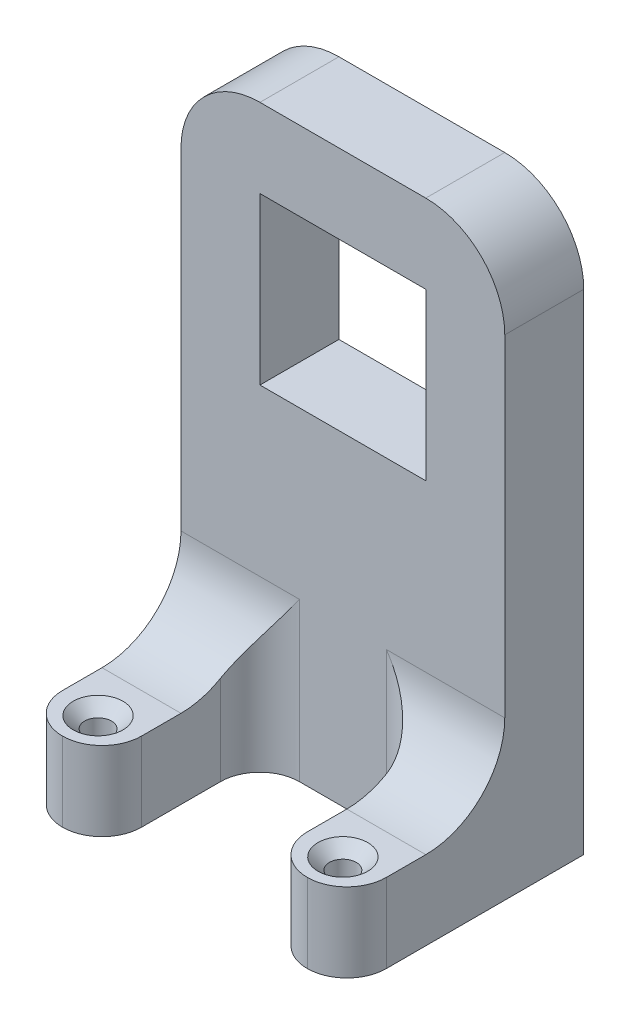
ISO-10303-21;
HEADER;
FILE_DESCRIPTION(('STEP AP214'),'2;1');
FILE_NAME('part.step','',(''),(''),'','','');
FILE_SCHEMA(('AUTOMOTIVE_DESIGN { 1 0 10303 214 1 1 1 1 }'));
ENDSEC;
DATA;
#1=APPLICATION_CONTEXT('core data for automotive mechanical design processes');
#2=APPLICATION_PROTOCOL_DEFINITION('international standard','automotive_design',2000,#1);
#3=PRODUCT_CONTEXT('',#1,'mechanical');
#4=PRODUCT('Part','Part','',(#3));
#5=PRODUCT_RELATED_PRODUCT_CATEGORY('part','',(#4));
#6=PRODUCT_DEFINITION_FORMATION('','',#4);
#7=PRODUCT_DEFINITION_CONTEXT('part definition',#1,'design');
#8=PRODUCT_DEFINITION('design','',#6,#7);
#9=PRODUCT_DEFINITION_SHAPE('','',#8);
#10=(LENGTH_UNIT() NAMED_UNIT(*) SI_UNIT(.MILLI.,.METRE.));
#11=(NAMED_UNIT(*) PLANE_ANGLE_UNIT() SI_UNIT($,.RADIAN.));
#12=(NAMED_UNIT(*) SI_UNIT($,.STERADIAN.) SOLID_ANGLE_UNIT());
#13=UNCERTAINTY_MEASURE_WITH_UNIT(LENGTH_MEASURE(1.E-05),#10,'distance_accuracy_value','');
#14=(GEOMETRIC_REPRESENTATION_CONTEXT(3) GLOBAL_UNCERTAINTY_ASSIGNED_CONTEXT((#13)) GLOBAL_UNIT_ASSIGNED_CONTEXT((#10,
#11,#12)) REPRESENTATION_CONTEXT('',''));
#15=CARTESIAN_POINT('',(0.,0.,0.));
#16=DIRECTION('',(0.,0.,1.));
#17=DIRECTION('',(1.,0.,0.));
#18=AXIS2_PLACEMENT_3D('',#15,#16,#17);
#19=CARTESIAN_POINT('',(0.,0.,10.));
#20=DIRECTION('',(0.,0.,1.));
#21=DIRECTION('',(1.,0.,0.));
#22=AXIS2_PLACEMENT_3D('',#19,#20,#21);
#23=PLANE('',#22);
#24=DIRECTION('',(1.,0.,0.));
#25=VECTOR('',#24,1.);
#26=CARTESIAN_POINT('',(10.,41.,10.));
#27=LINE('',#26,#25);
#28=CARTESIAN_POINT('',(10.,41.,10.));
#29=VERTEX_POINT('',#28);
#30=CARTESIAN_POINT('',(31.,41.,10.));
#31=VERTEX_POINT('',#30);
#32=EDGE_CURVE('E203',#29,#31,#27,.T.);
#33=ORIENTED_EDGE('',*,*,#32,.F.);
#34=DIRECTION('',(0.,-1.,0.));
#35=VECTOR('',#34,1.);
#36=CARTESIAN_POINT('',(10.,62.,10.));
#37=LINE('',#36,#35);
#38=CARTESIAN_POINT('',(10.,62.,10.));
#39=VERTEX_POINT('',#38);
#40=EDGE_CURVE('E192',#39,#29,#37,.T.);
#41=ORIENTED_EDGE('',*,*,#40,.F.);
#42=DIRECTION('',(-1.,0.,0.));
#43=VECTOR('',#42,1.);
#44=CARTESIAN_POINT('',(10.,62.,10.));
#45=LINE('',#44,#43);
#46=CARTESIAN_POINT('',(31.,62.,10.));
#47=VERTEX_POINT('',#46);
#48=EDGE_CURVE('E222',#47,#39,#45,.T.);
#49=ORIENTED_EDGE('',*,*,#48,.F.);
#50=DIRECTION('',(0.,1.,0.));
#51=VECTOR('',#50,1.);
#52=CARTESIAN_POINT('',(31.,62.,10.));
#53=LINE('',#52,#51);
#54=EDGE_CURVE('E218',#31,#47,#53,.T.);
#55=ORIENTED_EDGE('',*,*,#54,.F.);
#56=EDGE_LOOP('',(#33,#41,#49,#55));
#57=FACE_BOUND('',#56,.T.);
#58=DIRECTION('',(0.,-1.,0.));
#59=VECTOR('',#58,1.);
#60=CARTESIAN_POINT('',(26.,0.,10.));
#61=LINE('',#60,#59);
#62=CARTESIAN_POINT('',(26.,0.,10.));
#63=VERTEX_POINT('',#62);
#64=CARTESIAN_POINT('',(26.,20.,10.));
#65=VERTEX_POINT('',#64);
#66=EDGE_CURVE('E317',#63,#65,#61,.F.);
#67=ORIENTED_EDGE('',*,*,#66,.T.);
#68=DIRECTION('',(-1.,0.,0.));
#69=VECTOR('',#68,1.);
#70=CARTESIAN_POINT('',(0.,20.,10.));
#71=LINE('',#70,#69);
#72=CARTESIAN_POINT('',(41.,20.,10.));
#73=VERTEX_POINT('',#72);
#74=EDGE_CURVE('E382',#65,#73,#71,.F.);
#75=ORIENTED_EDGE('',*,*,#74,.T.);
#76=DIRECTION('',(0.,1.,0.));
#77=VECTOR('',#76,1.);
#78=CARTESIAN_POINT('',(41.,0.,10.));
#79=LINE('',#78,#77);
#80=CARTESIAN_POINT('',(41.,62.,10.));
#81=VERTEX_POINT('',#80);
#82=EDGE_CURVE('E257',#73,#81,#79,.T.);
#83=ORIENTED_EDGE('',*,*,#82,.T.);
#84=CARTESIAN_POINT('',(31.,62.,10.));
#85=DIRECTION('',(0.,0.,1.));
#86=DIRECTION('',(1.,0.,0.));
#87=AXIS2_PLACEMENT_3D('',#84,#85,#86);
#88=CIRCLE('',#87,10.);
#89=CARTESIAN_POINT('',(31.,72.,10.));
#90=VERTEX_POINT('',#89);
#91=EDGE_CURVE('E301',#81,#90,#88,.T.);
#92=ORIENTED_EDGE('',*,*,#91,.T.);
#93=DIRECTION('',(-1.,0.,0.));
#94=VECTOR('',#93,1.);
#95=CARTESIAN_POINT('',(41.,72.,10.));
#96=LINE('',#95,#94);
#97=CARTESIAN_POINT('',(10.,72.,10.));
#98=VERTEX_POINT('',#97);
#99=EDGE_CURVE('E260',#90,#98,#96,.T.);
#100=ORIENTED_EDGE('',*,*,#99,.T.);
#101=CARTESIAN_POINT('',(10.,62.,10.));
#102=DIRECTION('',(0.,0.,1.));
#103=DIRECTION('',(1.,0.,0.));
#104=AXIS2_PLACEMENT_3D('',#101,#102,#103);
#105=CIRCLE('',#104,10.);
#106=CARTESIAN_POINT('',(0.,62.,10.));
#107=VERTEX_POINT('',#106);
#108=EDGE_CURVE('E304',#98,#107,#105,.T.);
#109=ORIENTED_EDGE('',*,*,#108,.T.);
#110=DIRECTION('',(0.,-1.,0.));
#111=VECTOR('',#110,1.);
#112=CARTESIAN_POINT('',(0.,72.,10.));
#113=LINE('',#112,#111);
#114=CARTESIAN_POINT('',(0.,20.,10.));
#115=VERTEX_POINT('',#114);
#116=EDGE_CURVE('E248',#107,#115,#113,.T.);
#117=ORIENTED_EDGE('',*,*,#116,.T.);
#118=DIRECTION('',(-1.,0.,0.));
#119=VECTOR('',#118,1.);
#120=CARTESIAN_POINT('',(0.,20.,10.));
#121=LINE('',#120,#119);
#122=CARTESIAN_POINT('',(15.,20.,10.));
#123=VERTEX_POINT('',#122);
#124=EDGE_CURVE('E378',#115,#123,#121,.F.);
#125=ORIENTED_EDGE('',*,*,#124,.T.);
#126=DIRECTION('',(0.,1.,0.));
#127=VECTOR('',#126,1.);
#128=CARTESIAN_POINT('',(15.,0.,10.));
#129=LINE('',#128,#127);
#130=CARTESIAN_POINT('',(15.,0.,10.));
#131=VERTEX_POINT('',#130);
#132=EDGE_CURVE('E320',#123,#131,#129,.F.);
#133=ORIENTED_EDGE('',*,*,#132,.T.);
#134=DIRECTION('',(1.,0.,0.));
#135=VECTOR('',#134,1.);
#136=CARTESIAN_POINT('',(0.,0.,10.));
#137=LINE('',#136,#135);
#138=EDGE_CURVE('E252',#131,#63,#137,.T.);
#139=ORIENTED_EDGE('',*,*,#138,.T.);
#140=EDGE_LOOP('',(#67,#75,#83,#92,#100,#109,#117,#125,#133,#139));
#141=FACE_BOUND('',#140,.T.);
#142=ADVANCED_FACE('F39',(#57,#141),#23,.T.);
#143=CARTESIAN_POINT('',(0.,0.,0.));
#144=DIRECTION('',(0.,0.,1.));
#145=DIRECTION('',(1.,0.,0.));
#146=AXIS2_PLACEMENT_3D('',#143,#144,#145);
#147=PLANE('',#146);
#148=DIRECTION('',(0.,-1.,0.));
#149=VECTOR('',#148,1.);
#150=CARTESIAN_POINT('',(0.,72.,0.));
#151=LINE('',#150,#149);
#152=CARTESIAN_POINT('',(0.,62.,0.));
#153=VERTEX_POINT('',#152);
#154=CARTESIAN_POINT('',(0.,0.,0.));
#155=VERTEX_POINT('',#154);
#156=EDGE_CURVE('E212',#153,#155,#151,.T.);
#157=ORIENTED_EDGE('',*,*,#156,.F.);
#158=CARTESIAN_POINT('',(10.,62.,0.));
#159=DIRECTION('',(0.,0.,1.));
#160=DIRECTION('',(1.,0.,0.));
#161=AXIS2_PLACEMENT_3D('',#158,#159,#160);
#162=CIRCLE('',#161,10.);
#163=CARTESIAN_POINT('',(10.,72.,0.));
#164=VERTEX_POINT('',#163);
#165=EDGE_CURVE('E291',#153,#164,#162,.F.);
#166=ORIENTED_EDGE('',*,*,#165,.T.);
#167=DIRECTION('',(-1.,0.,0.));
#168=VECTOR('',#167,1.);
#169=CARTESIAN_POINT('',(41.,72.,0.));
#170=LINE('',#169,#168);
#171=CARTESIAN_POINT('',(31.,72.,0.));
#172=VERTEX_POINT('',#171);
#173=EDGE_CURVE('E253',#172,#164,#170,.T.);
#174=ORIENTED_EDGE('',*,*,#173,.F.);
#175=CARTESIAN_POINT('',(31.,62.,0.));
#176=DIRECTION('',(0.,0.,1.));
#177=DIRECTION('',(1.,0.,0.));
#178=AXIS2_PLACEMENT_3D('',#175,#176,#177);
#179=CIRCLE('',#178,10.);
#180=CARTESIAN_POINT('',(41.,62.,0.));
#181=VERTEX_POINT('',#180);
#182=EDGE_CURVE('E288',#172,#181,#179,.F.);
#183=ORIENTED_EDGE('',*,*,#182,.T.);
#184=DIRECTION('',(0.,1.,0.));
#185=VECTOR('',#184,1.);
#186=CARTESIAN_POINT('',(41.,0.,0.));
#187=LINE('',#186,#185);
#188=CARTESIAN_POINT('',(41.,0.,0.));
#189=VERTEX_POINT('',#188);
#190=EDGE_CURVE('E272',#189,#181,#187,.T.);
#191=ORIENTED_EDGE('',*,*,#190,.F.);
#192=DIRECTION('',(1.,0.,0.));
#193=VECTOR('',#192,1.);
#194=CARTESIAN_POINT('',(0.,0.,0.));
#195=LINE('',#194,#193);
#196=EDGE_CURVE('E268',#155,#189,#195,.T.);
#197=ORIENTED_EDGE('',*,*,#196,.F.);
#198=EDGE_LOOP('',(#157,#166,#174,#183,#191,#197));
#199=FACE_BOUND('',#198,.T.);
#200=DIRECTION('',(0.,-1.,0.));
#201=VECTOR('',#200,1.);
#202=CARTESIAN_POINT('',(10.,62.,0.));
#203=LINE('',#202,#201);
#204=CARTESIAN_POINT('',(10.,62.,0.));
#205=VERTEX_POINT('',#204);
#206=CARTESIAN_POINT('',(10.,41.,0.));
#207=VERTEX_POINT('',#206);
#208=EDGE_CURVE('E228',#205,#207,#203,.T.);
#209=ORIENTED_EDGE('',*,*,#208,.T.);
#210=DIRECTION('',(1.,0.,0.));
#211=VECTOR('',#210,1.);
#212=CARTESIAN_POINT('',(10.,41.,0.));
#213=LINE('',#212,#211);
#214=CARTESIAN_POINT('',(31.,41.,0.));
#215=VERTEX_POINT('',#214);
#216=EDGE_CURVE('E210',#207,#215,#213,.T.);
#217=ORIENTED_EDGE('',*,*,#216,.T.);
#218=DIRECTION('',(0.,1.,0.));
#219=VECTOR('',#218,1.);
#220=CARTESIAN_POINT('',(31.,62.,0.));
#221=LINE('',#220,#219);
#222=CARTESIAN_POINT('',(31.,62.,0.));
#223=VERTEX_POINT('',#222);
#224=EDGE_CURVE('E234',#215,#223,#221,.T.);
#225=ORIENTED_EDGE('',*,*,#224,.T.);
#226=DIRECTION('',(-1.,0.,0.));
#227=VECTOR('',#226,1.);
#228=CARTESIAN_POINT('',(10.,62.,0.));
#229=LINE('',#228,#227);
#230=EDGE_CURVE('E204',#223,#205,#229,.T.);
#231=ORIENTED_EDGE('',*,*,#230,.T.);
#232=EDGE_LOOP('',(#209,#217,#225,#231));
#233=FACE_BOUND('',#232,.T.);
#234=ADVANCED_FACE('F428',(#199,#233),#147,.F.);
#235=CARTESIAN_POINT('',(0.,72.,10.));
#236=DIRECTION('',(1.,0.,0.));
#237=DIRECTION('',(0.,1.,0.));
#238=AXIS2_PLACEMENT_3D('',#235,#236,#237);
#239=PLANE('',#238);
#240=DIRECTION('',(0.,0.,-1.));
#241=VECTOR('',#240,1.);
#242=CARTESIAN_POINT('',(0.,0.,10.));
#243=LINE('',#242,#241);
#244=CARTESIAN_POINT('',(0.,0.,25.));
#245=VERTEX_POINT('',#244);
#246=EDGE_CURVE('E281',#245,#155,#243,.T.);
#247=ORIENTED_EDGE('',*,*,#246,.F.);
#248=DIRECTION('',(0.,-1.,0.));
#249=VECTOR('',#248,1.);
#250=CARTESIAN_POINT('',(0.,10.,25.));
#251=LINE('',#250,#249);
#252=CARTESIAN_POINT('',(0.,10.,25.));
#253=VERTEX_POINT('',#252);
#254=EDGE_CURVE('E356',#245,#253,#251,.F.);
#255=ORIENTED_EDGE('',*,*,#254,.T.);
#256=DIRECTION('',(0.,0.,-1.));
#257=VECTOR('',#256,1.);
#258=CARTESIAN_POINT('',(0.,10.,30.));
#259=LINE('',#258,#257);
#260=CARTESIAN_POINT('',(0.,10.,20.));
#261=VERTEX_POINT('',#260);
#262=EDGE_CURVE('E490',#253,#261,#259,.T.);
#263=ORIENTED_EDGE('',*,*,#262,.T.);
#264=CARTESIAN_POINT('',(0.,20.,20.));
#265=DIRECTION('',(1.,0.,0.));
#266=DIRECTION('',(0.,1.,0.));
#267=AXIS2_PLACEMENT_3D('',#264,#265,#266);
#268=CIRCLE('',#267,10.);
#269=EDGE_CURVE('E471',#261,#115,#268,.T.);
#270=ORIENTED_EDGE('',*,*,#269,.T.);
#271=ORIENTED_EDGE('',*,*,#116,.F.);
#272=DIRECTION('',(0.,0.,-1.));
#273=VECTOR('',#272,1.);
#274=CARTESIAN_POINT('',(0.,62.,10.));
#275=LINE('',#274,#273);
#276=EDGE_CURVE('E284',#107,#153,#275,.T.);
#277=ORIENTED_EDGE('',*,*,#276,.T.);
#278=ORIENTED_EDGE('',*,*,#156,.T.);
#279=EDGE_LOOP('',(#247,#255,#263,#270,#271,#277,#278));
#280=FACE_BOUND('',#279,.T.);
#281=ADVANCED_FACE('F433',(#280),#239,.F.);
#282=CARTESIAN_POINT('',(0.,0.,10.));
#283=DIRECTION('',(0.,1.,0.));
#284=DIRECTION('',(0.,0.,1.));
#285=AXIS2_PLACEMENT_3D('',#282,#283,#284);
#286=PLANE('',#285);
#287=CARTESIAN_POINT('',(5.,0.,25.5));
#288=DIRECTION('',(0.,1.,0.));
#289=DIRECTION('',(0.,0.,1.));
#290=AXIS2_PLACEMENT_3D('',#287,#288,#289);
#291=CIRCLE('',#290,1.69999999999999);
#292=CARTESIAN_POINT('',(5.,0.,27.2));
#293=VERTEX_POINT('',#292);
#294=EDGE_CURVE('E764',#293,#293,#291,.T.);
#295=ORIENTED_EDGE('',*,*,#294,.T.);
#296=EDGE_LOOP('',(#295));
#297=FACE_BOUND('',#296,.T.);
#298=CARTESIAN_POINT('',(36.,0.,25.5));
#299=DIRECTION('',(0.,1.,0.));
#300=DIRECTION('',(0.,0.,1.));
#301=AXIS2_PLACEMENT_3D('',#298,#299,#300);
#302=CIRCLE('',#301,1.69999999999999);
#303=CARTESIAN_POINT('',(36.,0.,27.2));
#304=VERTEX_POINT('',#303);
#305=EDGE_CURVE('E504',#304,#304,#302,.T.);
#306=ORIENTED_EDGE('',*,*,#305,.T.);
#307=EDGE_LOOP('',(#306));
#308=FACE_BOUND('',#307,.T.);
#309=DIRECTION('',(0.,0.,-1.));
#310=VECTOR('',#309,1.);
#311=CARTESIAN_POINT('',(41.,0.,10.));
#312=LINE('',#311,#310);
#313=CARTESIAN_POINT('',(41.,0.,25.));
#314=VERTEX_POINT('',#313);
#315=EDGE_CURVE('E264',#314,#189,#312,.T.);
#316=ORIENTED_EDGE('',*,*,#315,.F.);
#317=CARTESIAN_POINT('',(36.,0.,25.));
#318=DIRECTION('',(0.,1.,0.));
#319=DIRECTION('',(0.,0.,1.));
#320=AXIS2_PLACEMENT_3D('',#317,#318,#319);
#321=CIRCLE('',#320,5.);
#322=CARTESIAN_POINT('',(36.,0.,30.));
#323=VERTEX_POINT('',#322);
#324=EDGE_CURVE('E347',#314,#323,#321,.F.);
#325=ORIENTED_EDGE('',*,*,#324,.T.);
#326=CARTESIAN_POINT('',(36.,0.,25.));
#327=DIRECTION('',(0.,1.,0.));
#328=DIRECTION('',(0.,0.,1.));
#329=AXIS2_PLACEMENT_3D('',#326,#327,#328);
#330=CIRCLE('',#329,5.);
#331=CARTESIAN_POINT('',(31.,0.,25.));
#332=VERTEX_POINT('',#331);
#333=EDGE_CURVE('E344',#323,#332,#330,.F.);
#334=ORIENTED_EDGE('',*,*,#333,.T.);
#335=DIRECTION('',(0.,0.,-1.));
#336=VECTOR('',#335,1.);
#337=CARTESIAN_POINT('',(31.,0.,30.));
#338=LINE('',#337,#336);
#339=CARTESIAN_POINT('',(31.,0.,15.));
#340=VERTEX_POINT('',#339);
#341=EDGE_CURVE('E501',#332,#340,#338,.T.);
#342=ORIENTED_EDGE('',*,*,#341,.T.);
#343=CARTESIAN_POINT('',(26.,0.,15.));
#344=DIRECTION('',(0.,1.,0.));
#345=DIRECTION('',(0.,0.,1.));
#346=AXIS2_PLACEMENT_3D('',#343,#344,#345);
#347=CIRCLE('',#346,5.);
#348=EDGE_CURVE('E362',#340,#63,#347,.T.);
#349=ORIENTED_EDGE('',*,*,#348,.T.);
#350=ORIENTED_EDGE('',*,*,#138,.F.);
#351=CARTESIAN_POINT('',(15.,0.,15.));
#352=DIRECTION('',(0.,1.,0.));
#353=DIRECTION('',(0.,0.,1.));
#354=AXIS2_PLACEMENT_3D('',#351,#352,#353);
#355=CIRCLE('',#354,5.);
#356=CARTESIAN_POINT('',(10.,0.,15.));
#357=VERTEX_POINT('',#356);
#358=EDGE_CURVE('E359',#131,#357,#355,.T.);
#359=ORIENTED_EDGE('',*,*,#358,.T.);
#360=DIRECTION('',(0.,0.,-1.));
#361=VECTOR('',#360,1.);
#362=CARTESIAN_POINT('',(10.,0.,30.));
#363=LINE('',#362,#361);
#364=CARTESIAN_POINT('',(10.,0.,25.));
#365=VERTEX_POINT('',#364);
#366=EDGE_CURVE('E231',#365,#357,#363,.T.);
#367=ORIENTED_EDGE('',*,*,#366,.F.);
#368=CARTESIAN_POINT('',(5.,0.,25.));
#369=DIRECTION('',(0.,1.,0.));
#370=DIRECTION('',(0.,0.,1.));
#371=AXIS2_PLACEMENT_3D('',#368,#369,#370);
#372=CIRCLE('',#371,5.);
#373=CARTESIAN_POINT('',(5.,0.,30.));
#374=VERTEX_POINT('',#373);
#375=EDGE_CURVE('E341',#365,#374,#372,.F.);
#376=ORIENTED_EDGE('',*,*,#375,.T.);
#377=CARTESIAN_POINT('',(5.,0.,25.));
#378=DIRECTION('',(0.,1.,0.));
#379=DIRECTION('',(0.,0.,1.));
#380=AXIS2_PLACEMENT_3D('',#377,#378,#379);
#381=CIRCLE('',#380,5.);
#382=EDGE_CURVE('E338',#374,#245,#381,.F.);
#383=ORIENTED_EDGE('',*,*,#382,.T.);
#384=ORIENTED_EDGE('',*,*,#246,.T.);
#385=ORIENTED_EDGE('',*,*,#196,.T.);
#386=EDGE_LOOP('',(#316,#325,#334,#342,#349,#350,#359,#367,#376,#383,#384,#385));
#387=FACE_BOUND('',#386,.T.);
#388=ADVANCED_FACE('F446',(#297,#308,#387),#286,.F.);
#389=CARTESIAN_POINT('',(41.,0.,10.));
#390=DIRECTION('',(-1.,0.,0.));
#391=DIRECTION('',(0.,0.,1.));
#392=AXIS2_PLACEMENT_3D('',#389,#390,#391);
#393=PLANE('',#392);
#394=DIRECTION('',(0.,0.,-1.));
#395=VECTOR('',#394,1.);
#396=CARTESIAN_POINT('',(41.,10.,30.));
#397=LINE('',#396,#395);
#398=CARTESIAN_POINT('',(41.,10.,25.));
#399=VERTEX_POINT('',#398);
#400=CARTESIAN_POINT('',(41.,10.,20.));
#401=VERTEX_POINT('',#400);
#402=EDGE_CURVE('E480',#399,#401,#397,.T.);
#403=ORIENTED_EDGE('',*,*,#402,.F.);
#404=DIRECTION('',(0.,1.,0.));
#405=VECTOR('',#404,1.);
#406=CARTESIAN_POINT('',(41.,0.,25.));
#407=LINE('',#406,#405);
#408=EDGE_CURVE('E334',#399,#314,#407,.F.);
#409=ORIENTED_EDGE('',*,*,#408,.T.);
#410=ORIENTED_EDGE('',*,*,#315,.T.);
#411=ORIENTED_EDGE('',*,*,#190,.T.);
#412=DIRECTION('',(0.,0.,-1.));
#413=VECTOR('',#412,1.);
#414=CARTESIAN_POINT('',(41.,62.,10.));
#415=LINE('',#414,#413);
#416=EDGE_CURVE('E307',#181,#81,#415,.F.);
#417=ORIENTED_EDGE('',*,*,#416,.T.);
#418=ORIENTED_EDGE('',*,*,#82,.F.);
#419=CARTESIAN_POINT('',(41.,20.,20.));
#420=DIRECTION('',(-1.,0.,0.));
#421=DIRECTION('',(0.,0.,1.));
#422=AXIS2_PLACEMENT_3D('',#419,#420,#421);
#423=CIRCLE('',#422,10.);
#424=EDGE_CURVE('E400',#73,#401,#423,.T.);
#425=ORIENTED_EDGE('',*,*,#424,.T.);
#426=EDGE_LOOP('',(#403,#409,#410,#411,#417,#418,#425));
#427=FACE_BOUND('',#426,.T.);
#428=ADVANCED_FACE('F442',(#427),#393,.F.);
#429=CARTESIAN_POINT('',(41.,72.,10.));
#430=DIRECTION('',(0.,-1.,0.));
#431=DIRECTION('',(0.,0.,-1.));
#432=AXIS2_PLACEMENT_3D('',#429,#430,#431);
#433=PLANE('',#432);
#434=ORIENTED_EDGE('',*,*,#173,.T.);
#435=DIRECTION('',(0.,0.,-1.));
#436=VECTOR('',#435,1.);
#437=CARTESIAN_POINT('',(10.,72.,10.));
#438=LINE('',#437,#436);
#439=EDGE_CURVE('E298',#164,#98,#438,.F.);
#440=ORIENTED_EDGE('',*,*,#439,.T.);
#441=ORIENTED_EDGE('',*,*,#99,.F.);
#442=DIRECTION('',(0.,0.,-1.));
#443=VECTOR('',#442,1.);
#444=CARTESIAN_POINT('',(31.,72.,10.));
#445=LINE('',#444,#443);
#446=EDGE_CURVE('E294',#90,#172,#445,.T.);
#447=ORIENTED_EDGE('',*,*,#446,.T.);
#448=EDGE_LOOP('',(#434,#440,#441,#447));
#449=FACE_BOUND('',#448,.T.);
#450=ADVANCED_FACE('F439',(#449),#433,.F.);
#451=CARTESIAN_POINT('',(10.,62.,10.));
#452=DIRECTION('',(1.,0.,0.));
#453=DIRECTION('',(0.,1.,0.));
#454=AXIS2_PLACEMENT_3D('',#451,#452,#453);
#455=PLANE('',#454);
#456=ORIENTED_EDGE('',*,*,#208,.F.);
#457=DIRECTION('',(0.,0.,-1.));
#458=VECTOR('',#457,1.);
#459=CARTESIAN_POINT('',(10.,62.,10.));
#460=LINE('',#459,#458);
#461=EDGE_CURVE('E198',#39,#205,#460,.T.);
#462=ORIENTED_EDGE('',*,*,#461,.F.);
#463=ORIENTED_EDGE('',*,*,#40,.T.);
#464=DIRECTION('',(0.,0.,-1.));
#465=VECTOR('',#464,1.);
#466=CARTESIAN_POINT('',(10.,41.,10.));
#467=LINE('',#466,#465);
#468=EDGE_CURVE('E195',#29,#207,#467,.T.);
#469=ORIENTED_EDGE('',*,*,#468,.T.);
#470=EDGE_LOOP('',(#456,#462,#463,#469));
#471=FACE_BOUND('',#470,.T.);
#472=ADVANCED_FACE('F194',(#471),#455,.T.);
#473=CARTESIAN_POINT('',(10.,41.,10.));
#474=DIRECTION('',(0.,1.,0.));
#475=DIRECTION('',(0.,0.,1.));
#476=AXIS2_PLACEMENT_3D('',#473,#474,#475);
#477=PLANE('',#476);
#478=ORIENTED_EDGE('',*,*,#216,.F.);
#479=ORIENTED_EDGE('',*,*,#468,.F.);
#480=ORIENTED_EDGE('',*,*,#32,.T.);
#481=DIRECTION('',(0.,0.,-1.));
#482=VECTOR('',#481,1.);
#483=CARTESIAN_POINT('',(31.,41.,10.));
#484=LINE('',#483,#482);
#485=EDGE_CURVE('E213',#31,#215,#484,.T.);
#486=ORIENTED_EDGE('',*,*,#485,.T.);
#487=EDGE_LOOP('',(#478,#479,#480,#486));
#488=FACE_BOUND('',#487,.T.);
#489=ADVANCED_FACE('F207',(#488),#477,.T.);
#490=CARTESIAN_POINT('',(31.,62.,10.));
#491=DIRECTION('',(-1.,0.,0.));
#492=DIRECTION('',(0.,-1.,0.));
#493=AXIS2_PLACEMENT_3D('',#490,#491,#492);
#494=PLANE('',#493);
#495=ORIENTED_EDGE('',*,*,#224,.F.);
#496=ORIENTED_EDGE('',*,*,#485,.F.);
#497=ORIENTED_EDGE('',*,*,#54,.T.);
#498=DIRECTION('',(0.,0.,-1.));
#499=VECTOR('',#498,1.);
#500=CARTESIAN_POINT('',(31.,62.,10.));
#501=LINE('',#500,#499);
#502=EDGE_CURVE('E243',#47,#223,#501,.T.);
#503=ORIENTED_EDGE('',*,*,#502,.T.);
#504=EDGE_LOOP('',(#495,#496,#497,#503));
#505=FACE_BOUND('',#504,.T.);
#506=ADVANCED_FACE('F696',(#505),#494,.T.);
#507=CARTESIAN_POINT('',(10.,62.,10.));
#508=DIRECTION('',(0.,-1.,0.));
#509=DIRECTION('',(0.,0.,-1.));
#510=AXIS2_PLACEMENT_3D('',#507,#508,#509);
#511=PLANE('',#510);
#512=ORIENTED_EDGE('',*,*,#230,.F.);
#513=ORIENTED_EDGE('',*,*,#502,.F.);
#514=ORIENTED_EDGE('',*,*,#48,.T.);
#515=ORIENTED_EDGE('',*,*,#461,.T.);
#516=EDGE_LOOP('',(#512,#513,#514,#515));
#517=FACE_BOUND('',#516,.T.);
#518=ADVANCED_FACE('F609',(#517),#511,.T.);
#519=CARTESIAN_POINT('',(10.,0.,30.));
#520=DIRECTION('',(-1.,0.,0.));
#521=DIRECTION('',(0.,0.,1.));
#522=AXIS2_PLACEMENT_3D('',#519,#520,#521);
#523=PLANE('',#522);
#524=ORIENTED_EDGE('',*,*,#366,.T.);
#525=DIRECTION('',(0.,1.,0.));
#526=VECTOR('',#525,1.);
#527=CARTESIAN_POINT('',(10.,0.,15.));
#528=LINE('',#527,#526);
#529=CARTESIAN_POINT('',(10.,11.3397459621556,15.));
#530=VERTEX_POINT('',#529);
#531=EDGE_CURVE('E55',#357,#530,#528,.T.);
#532=ORIENTED_EDGE('',*,*,#531,.T.);
#533=CARTESIAN_POINT('',(10.,20.,20.));
#534=DIRECTION('',(-1.,0.,0.));
#535=DIRECTION('',(0.,0.,1.));
#536=AXIS2_PLACEMENT_3D('',#533,#534,#535);
#537=CIRCLE('',#536,10.);
#538=CARTESIAN_POINT('',(10.,10.,20.));
#539=VERTEX_POINT('',#538);
#540=EDGE_CURVE('E11',#530,#539,#537,.T.);
#541=ORIENTED_EDGE('',*,*,#540,.T.);
#542=DIRECTION('',(0.,0.,-1.));
#543=VECTOR('',#542,1.);
#544=CARTESIAN_POINT('',(10.,10.,30.));
#545=LINE('',#544,#543);
#546=CARTESIAN_POINT('',(10.,10.,25.));
#547=VERTEX_POINT('',#546);
#548=EDGE_CURVE('E510',#547,#539,#545,.T.);
#549=ORIENTED_EDGE('',*,*,#548,.F.);
#550=DIRECTION('',(0.,1.,0.));
#551=VECTOR('',#550,1.);
#552=CARTESIAN_POINT('',(10.,0.,25.));
#553=LINE('',#552,#551);
#554=EDGE_CURVE('E311',#547,#365,#553,.F.);
#555=ORIENTED_EDGE('',*,*,#554,.T.);
#556=EDGE_LOOP('',(#524,#532,#541,#549,#555));
#557=FACE_BOUND('',#556,.T.);
#558=ADVANCED_FACE('F515',(#557),#523,.F.);
#559=CARTESIAN_POINT('',(0.,10.,30.));
#560=DIRECTION('',(0.,-1.,0.));
#561=DIRECTION('',(1.,0.,0.));
#562=AXIS2_PLACEMENT_3D('',#559,#560,#561);
#563=PLANE('',#562);
#564=CARTESIAN_POINT('',(5.,10.,25.5));
#565=DIRECTION('',(0.,1.,0.));
#566=DIRECTION('',(0.,0.,1.));
#567=AXIS2_PLACEMENT_3D('',#564,#565,#566);
#568=CIRCLE('',#567,3.15);
#569=CARTESIAN_POINT('',(5.,10.,28.65));
#570=VERTEX_POINT('',#569);
#571=EDGE_CURVE('E370',#570,#570,#568,.T.);
#572=ORIENTED_EDGE('',*,*,#571,.F.);
#573=EDGE_LOOP('',(#572));
#574=FACE_BOUND('',#573,.T.);
#575=ORIENTED_EDGE('',*,*,#548,.T.);
#576=DIRECTION('',(-1.,0.,0.));
#577=VECTOR('',#576,1.);
#578=CARTESIAN_POINT('',(0.,10.,20.));
#579=LINE('',#578,#577);
#580=EDGE_CURVE('E385',#539,#261,#579,.T.);
#581=ORIENTED_EDGE('',*,*,#580,.T.);
#582=ORIENTED_EDGE('',*,*,#262,.F.);
#583=CARTESIAN_POINT('',(5.,10.,25.));
#584=DIRECTION('',(0.,-1.,0.));
#585=DIRECTION('',(1.,0.,0.));
#586=AXIS2_PLACEMENT_3D('',#583,#584,#585);
#587=CIRCLE('',#586,5.);
#588=CARTESIAN_POINT('',(5.,10.,30.));
#589=VERTEX_POINT('',#588);
#590=EDGE_CURVE('E350',#253,#589,#587,.F.);
#591=ORIENTED_EDGE('',*,*,#590,.T.);
#592=CARTESIAN_POINT('',(5.,10.,25.));
#593=DIRECTION('',(0.,-1.,0.));
#594=DIRECTION('',(1.,0.,0.));
#595=AXIS2_PLACEMENT_3D('',#592,#593,#594);
#596=CIRCLE('',#595,5.);
#597=EDGE_CURVE('E353',#589,#547,#596,.F.);
#598=ORIENTED_EDGE('',*,*,#597,.T.);
#599=EDGE_LOOP('',(#575,#581,#582,#591,#598));
#600=FACE_BOUND('',#599,.T.);
#601=ADVANCED_FACE('F526',(#574,#600),#563,.F.);
#602=CARTESIAN_POINT('',(41.,10.,30.));
#603=DIRECTION('',(0.,-1.,0.));
#604=DIRECTION('',(1.,0.,0.));
#605=AXIS2_PLACEMENT_3D('',#602,#603,#604);
#606=PLANE('',#605);
#607=CARTESIAN_POINT('',(36.,10.,25.5));
#608=DIRECTION('',(0.,1.,0.));
#609=DIRECTION('',(0.,0.,1.));
#610=AXIS2_PLACEMENT_3D('',#607,#608,#609);
#611=CIRCLE('',#610,3.15);
#612=CARTESIAN_POINT('',(36.,10.,28.65));
#613=VERTEX_POINT('',#612);
#614=EDGE_CURVE('E759',#613,#613,#611,.T.);
#615=ORIENTED_EDGE('',*,*,#614,.F.);
#616=EDGE_LOOP('',(#615));
#617=FACE_BOUND('',#616,.T.);
#618=ORIENTED_EDGE('',*,*,#402,.T.);
#619=DIRECTION('',(-1.,0.,0.));
#620=VECTOR('',#619,1.);
#621=CARTESIAN_POINT('',(41.,10.,20.));
#622=LINE('',#621,#620);
#623=CARTESIAN_POINT('',(31.,10.,20.));
#624=VERTEX_POINT('',#623);
#625=EDGE_CURVE('E365',#401,#624,#622,.T.);
#626=ORIENTED_EDGE('',*,*,#625,.T.);
#627=DIRECTION('',(0.,0.,-1.));
#628=VECTOR('',#627,1.);
#629=CARTESIAN_POINT('',(31.,10.,30.));
#630=LINE('',#629,#628);
#631=CARTESIAN_POINT('',(31.,10.,25.));
#632=VERTEX_POINT('',#631);
#633=EDGE_CURVE('E491',#632,#624,#630,.T.);
#634=ORIENTED_EDGE('',*,*,#633,.F.);
#635=CARTESIAN_POINT('',(36.,10.,25.));
#636=DIRECTION('',(0.,-1.,0.));
#637=DIRECTION('',(1.,0.,0.));
#638=AXIS2_PLACEMENT_3D('',#635,#636,#637);
#639=CIRCLE('',#638,5.);
#640=CARTESIAN_POINT('',(36.,10.,30.));
#641=VERTEX_POINT('',#640);
#642=EDGE_CURVE('E328',#632,#641,#639,.F.);
#643=ORIENTED_EDGE('',*,*,#642,.T.);
#644=CARTESIAN_POINT('',(36.,10.,25.));
#645=DIRECTION('',(0.,-1.,0.));
#646=DIRECTION('',(1.,0.,0.));
#647=AXIS2_PLACEMENT_3D('',#644,#645,#646);
#648=CIRCLE('',#647,5.);
#649=EDGE_CURVE('E331',#641,#399,#648,.F.);
#650=ORIENTED_EDGE('',*,*,#649,.T.);
#651=EDGE_LOOP('',(#618,#626,#634,#643,#650));
#652=FACE_BOUND('',#651,.T.);
#653=ADVANCED_FACE('F485',(#617,#652),#606,.F.);
#654=CARTESIAN_POINT('',(31.,0.,30.));
#655=DIRECTION('',(1.,0.,0.));
#656=DIRECTION('',(0.,0.,-1.));
#657=AXIS2_PLACEMENT_3D('',#654,#655,#656);
#658=PLANE('',#657);
#659=ORIENTED_EDGE('',*,*,#633,.T.);
#660=CARTESIAN_POINT('',(31.,20.,20.));
#661=DIRECTION('',(1.,0.,0.));
#662=DIRECTION('',(0.,0.,-1.));
#663=AXIS2_PLACEMENT_3D('',#660,#661,#662);
#664=CIRCLE('',#663,10.);
#665=CARTESIAN_POINT('',(31.,11.3397459621556,15.));
#666=VERTEX_POINT('',#665);
#667=EDGE_CURVE('E389',#624,#666,#664,.T.);
#668=ORIENTED_EDGE('',*,*,#667,.T.);
#669=DIRECTION('',(0.,-1.,0.));
#670=VECTOR('',#669,1.);
#671=CARTESIAN_POINT('',(31.,0.,15.));
#672=LINE('',#671,#670);
#673=EDGE_CURVE('E63',#666,#340,#672,.T.);
#674=ORIENTED_EDGE('',*,*,#673,.T.);
#675=ORIENTED_EDGE('',*,*,#341,.F.);
#676=DIRECTION('',(0.,-1.,0.));
#677=VECTOR('',#676,1.);
#678=CARTESIAN_POINT('',(31.,10.,25.));
#679=LINE('',#678,#677);
#680=EDGE_CURVE('E323',#332,#632,#679,.F.);
#681=ORIENTED_EDGE('',*,*,#680,.T.);
#682=EDGE_LOOP('',(#659,#668,#674,#675,#681));
#683=FACE_BOUND('',#682,.T.);
#684=ADVANCED_FACE('F495',(#683),#658,.F.);
#685=CARTESIAN_POINT('',(36.,10.,25.5));
#686=DIRECTION('',(0.,1.,0.));
#687=DIRECTION('',(0.,0.,1.));
#688=AXIS2_PLACEMENT_3D('',#685,#686,#687);
#689=CYLINDRICAL_SURFACE('',#688,1.69999999999999);
#690=ORIENTED_EDGE('',*,*,#305,.F.);
#691=EDGE_LOOP('',(#690));
#692=FACE_BOUND('',#691,.T.);
#693=CARTESIAN_POINT('',(36.,8.55,25.5));
#694=DIRECTION('',(0.,1.,0.));
#695=DIRECTION('',(0.,0.,1.));
#696=AXIS2_PLACEMENT_3D('',#693,#694,#695);
#697=CIRCLE('',#696,1.7);
#698=CARTESIAN_POINT('',(36.,8.55,27.2));
#699=VERTEX_POINT('',#698);
#700=EDGE_CURVE('E757',#699,#699,#697,.T.);
#701=ORIENTED_EDGE('',*,*,#700,.T.);
#702=EDGE_LOOP('',(#701));
#703=FACE_BOUND('',#702,.T.);
#704=ADVANCED_FACE('F636',(#692,#703),#689,.F.);
#705=CARTESIAN_POINT('',(36.,10.,25.5));
#706=DIRECTION('',(0.,1.,0.));
#707=DIRECTION('',(0.,0.,1.));
#708=AXIS2_PLACEMENT_3D('',#705,#706,#707);
#709=CONICAL_SURFACE('',#708,3.15,0.785398163397447);
#710=ORIENTED_EDGE('',*,*,#700,.F.);
#711=EDGE_LOOP('',(#710));
#712=FACE_BOUND('',#711,.T.);
#713=ORIENTED_EDGE('',*,*,#614,.T.);
#714=EDGE_LOOP('',(#713));
#715=FACE_BOUND('',#714,.T.);
#716=ADVANCED_FACE('F675',(#712,#715),#709,.F.);
#717=CARTESIAN_POINT('',(5.,10.,25.5));
#718=DIRECTION('',(0.,1.,0.));
#719=DIRECTION('',(0.,0.,1.));
#720=AXIS2_PLACEMENT_3D('',#717,#718,#719);
#721=CYLINDRICAL_SURFACE('',#720,1.69999999999999);
#722=ORIENTED_EDGE('',*,*,#294,.F.);
#723=EDGE_LOOP('',(#722));
#724=FACE_BOUND('',#723,.T.);
#725=CARTESIAN_POINT('',(5.,8.55,25.5));
#726=DIRECTION('',(0.,1.,0.));
#727=DIRECTION('',(0.,0.,1.));
#728=AXIS2_PLACEMENT_3D('',#725,#726,#727);
#729=CIRCLE('',#728,1.7);
#730=CARTESIAN_POINT('',(5.,8.55,27.2));
#731=VERTEX_POINT('',#730);
#732=EDGE_CURVE('E770',#731,#731,#729,.T.);
#733=ORIENTED_EDGE('',*,*,#732,.T.);
#734=EDGE_LOOP('',(#733));
#735=FACE_BOUND('',#734,.T.);
#736=ADVANCED_FACE('F665',(#724,#735),#721,.F.);
#737=CARTESIAN_POINT('',(5.,10.,25.5));
#738=DIRECTION('',(0.,1.,0.));
#739=DIRECTION('',(0.,0.,1.));
#740=AXIS2_PLACEMENT_3D('',#737,#738,#739);
#741=CONICAL_SURFACE('',#740,3.15,0.785398163397448);
#742=ORIENTED_EDGE('',*,*,#732,.F.);
#743=EDGE_LOOP('',(#742));
#744=FACE_BOUND('',#743,.T.);
#745=ORIENTED_EDGE('',*,*,#571,.T.);
#746=EDGE_LOOP('',(#745));
#747=FACE_BOUND('',#746,.T.);
#748=ADVANCED_FACE('F458',(#744,#747),#741,.F.);
#749=CARTESIAN_POINT('',(10.,62.,10.));
#750=DIRECTION('',(0.,0.,-1.));
#751=DIRECTION('',(-1.,0.,0.));
#752=AXIS2_PLACEMENT_3D('',#749,#750,#751);
#753=CYLINDRICAL_SURFACE('',#752,10.);
#754=ORIENTED_EDGE('',*,*,#108,.F.);
#755=ORIENTED_EDGE('',*,*,#439,.F.);
#756=ORIENTED_EDGE('',*,*,#165,.F.);
#757=ORIENTED_EDGE('',*,*,#276,.F.);
#758=EDGE_LOOP('',(#754,#755,#756,#757));
#759=FACE_BOUND('',#758,.T.);
#760=ADVANCED_FACE('F454',(#759),#753,.T.);
#761=CARTESIAN_POINT('',(31.,62.,10.));
#762=DIRECTION('',(0.,0.,-1.));
#763=DIRECTION('',(-1.,0.,0.));
#764=AXIS2_PLACEMENT_3D('',#761,#762,#763);
#765=CYLINDRICAL_SURFACE('',#764,10.);
#766=ORIENTED_EDGE('',*,*,#91,.F.);
#767=ORIENTED_EDGE('',*,*,#416,.F.);
#768=ORIENTED_EDGE('',*,*,#182,.F.);
#769=ORIENTED_EDGE('',*,*,#446,.F.);
#770=EDGE_LOOP('',(#766,#767,#768,#769));
#771=FACE_BOUND('',#770,.T.);
#772=ADVANCED_FACE('F457',(#771),#765,.T.);
#773=CARTESIAN_POINT('',(15.,0.,15.));
#774=DIRECTION('',(0.,1.,0.));
#775=DIRECTION('',(0.,0.,1.));
#776=AXIS2_PLACEMENT_3D('',#773,#774,#775);
#777=CYLINDRICAL_SURFACE('',#776,5.);
#778=ORIENTED_EDGE('',*,*,#358,.F.);
#779=ORIENTED_EDGE('',*,*,#132,.F.);
#780=CARTESIAN_POINT('',(10.,11.3397459621556,15.));
#781=CARTESIAN_POINT('',(10.0000002829008,11.3937879925422,14.9063901960152));
#782=CARTESIAN_POINT('',(10.0026288745514,11.4493370450479,14.8136887355509));
#783=CARTESIAN_POINT('',(10.012837252933,11.5632598676786,14.6303586139701));
#784=CARTESIAN_POINT('',(10.0204153066888,11.6216326425008,14.5397292388373));
#785=CARTESIAN_POINT('',(10.0500643550123,11.8004330191291,14.2717275596113));
#786=CARTESIAN_POINT('',(10.0790536521328,11.924841456128,14.0977250390683));
#787=CARTESIAN_POINT('',(10.1525618576713,12.1809555652442,13.7624925016688));
#788=CARTESIAN_POINT('',(10.1968699815399,12.3125427544919,13.6011238336321));
#789=CARTESIAN_POINT('',(10.2989271645852,12.5832785991352,13.2891932012269));
#790=CARTESIAN_POINT('',(10.356686112509,12.7224327596275,13.1386392947014));
#791=CARTESIAN_POINT('',(10.4957352209033,13.0341117153437,12.8212230033609));
#792=CARTESIAN_POINT('',(10.5794113795357,13.2079514131221,12.6567013063151));
#793=CARTESIAN_POINT('',(10.7601137242358,13.5628582648149,12.3436812510737));
#794=CARTESIAN_POINT('',(10.8571401959647,13.7439255733221,12.1951832358636));
#795=CARTESIAN_POINT('',(11.0627415552706,14.1129670584648,11.9131540087972));
#796=CARTESIAN_POINT('',(11.171378189803,14.300974290573,11.7797114564667));
#797=CARTESIAN_POINT('',(11.3977617022044,14.6818346986898,11.5283293342775));
#798=CARTESIAN_POINT('',(11.5155112343589,14.8746892754414,11.4103943084497));
#799=CARTESIAN_POINT('',(11.8076692204953,15.3432640618171,11.1448413677447));
#800=CARTESIAN_POINT('',(11.9857031510398,15.620897636726,11.0045589604871));
#801=CARTESIAN_POINT('',(12.3527000735922,16.1818735581882,10.752485139773));
#802=CARTESIAN_POINT('',(12.5416679240638,16.465218405523,10.6407065130599));
#803=CARTESIAN_POINT('',(12.9272097213761,17.0355220744025,10.4447587075372));
#804=CARTESIAN_POINT('',(13.1237717834615,17.322474809907,10.3605481977862));
#805=CARTESIAN_POINT('',(13.5222274057551,17.8990145082232,10.2186939466712));
#806=CARTESIAN_POINT('',(13.7241186307513,18.1886002819473,10.1610387667105));
#807=CARTESIAN_POINT('',(14.1029157974057,18.72909183788,10.0778620545014));
#808=CARTESIAN_POINT('',(14.2794008009863,18.9797882487088,10.0489914504686));
#809=CARTESIAN_POINT('',(14.6334209377075,19.4815673839878,10.0102820427947));
#810=CARTESIAN_POINT('',(14.8109547658963,19.7326494214385,10.0004231842985));
#811=CARTESIAN_POINT('',(14.9923020170791,19.9891134078932,10.0000044457948));
#812=CARTESIAN_POINT('',(14.9961510202373,19.9945567203506,10.0000000014709));
#813=CARTESIAN_POINT('',(15.,20.,10.));
#814=B_SPLINE_CURVE_WITH_KNOTS('',3,(#780,#781,#782,#783,#784,#785,#786,#787,#788,#789,#790,
#791,#792,#793,#794,#795,#796,#797,#798,#799,#800,#801,#802,#803,#804,#805,#806,#807,#808,#809,
#810,#811,#812,#813),.UNSPECIFIED.,.F.,.F.,(4,2,2,2,2,2,2,2,2,2,2,2,2,2,2,2,4),(0.,
0.324164501699154,0.648215563169973,1.29453690515217,1.93229735394221,2.57052815854178,
3.33008992767271,4.0896679519408,4.85350822338372,5.61757181965429,6.69122947966725,
7.76536793656894,8.83788855857112,9.90994676377595,10.8332249647611,11.7555286965104,
11.7755287009549),.UNSPECIFIED.);
#815=EDGE_CURVE('E49',#123,#530,#814,.F.);
#816=ORIENTED_EDGE('',*,*,#815,.T.);
#817=ORIENTED_EDGE('',*,*,#531,.F.);
#818=EDGE_LOOP('',(#778,#779,#816,#817));
#819=FACE_BOUND('',#818,.T.);
#820=ADVANCED_FACE('F461',(#819),#777,.F.);
#821=CARTESIAN_POINT('',(26.,0.,15.));
#822=DIRECTION('',(0.,-1.,0.));
#823=DIRECTION('',(0.,0.,-1.));
#824=AXIS2_PLACEMENT_3D('',#821,#822,#823);
#825=CYLINDRICAL_SURFACE('',#824,5.);
#826=ORIENTED_EDGE('',*,*,#673,.F.);
#827=CARTESIAN_POINT('',(31.,11.3397459621556,15.));
#828=CARTESIAN_POINT('',(30.9999997170992,11.3937879925422,14.9063901960152));
#829=CARTESIAN_POINT('',(30.9973711254486,11.4493370450479,14.8136887355509));
#830=CARTESIAN_POINT('',(30.987162747067,11.5632598676786,14.6303586139701));
#831=CARTESIAN_POINT('',(30.9795846933112,11.6216326425008,14.5397292388373));
#832=CARTESIAN_POINT('',(30.9499356449877,11.8004330191291,14.2717275596113));
#833=CARTESIAN_POINT('',(30.9209463478672,11.9248414561281,14.0977250390683));
#834=CARTESIAN_POINT('',(30.8474381423286,12.1809555652443,13.7624925016688));
#835=CARTESIAN_POINT('',(30.8031300184601,12.3125427544919,13.6011238336321));
#836=CARTESIAN_POINT('',(30.7010728354148,12.5832785991352,13.2891932012269));
#837=CARTESIAN_POINT('',(30.643313887491,12.7224327596275,13.1386392947014));
#838=CARTESIAN_POINT('',(30.5042647790967,13.0341117153437,12.8212230033609));
#839=CARTESIAN_POINT('',(30.4205886204643,13.2079514131221,12.6567013063151));
#840=CARTESIAN_POINT('',(30.2398862757642,13.5628582648149,12.3436812510737));
#841=CARTESIAN_POINT('',(30.1428598040353,13.7439255733221,12.1951832358636));
#842=CARTESIAN_POINT('',(29.9372584447294,14.1129670584648,11.9131540087972));
#843=CARTESIAN_POINT('',(29.8286218101969,14.300974290573,11.7797114564667));
#844=CARTESIAN_POINT('',(29.6022382977956,14.6818346986898,11.5283293342775));
#845=CARTESIAN_POINT('',(29.4844887656411,14.8746892754414,11.4103943084497));
#846=CARTESIAN_POINT('',(29.1923307795046,15.3432640618171,11.1448413677447));
#847=CARTESIAN_POINT('',(29.0142968489602,15.620897636726,11.0045589604871));
#848=CARTESIAN_POINT('',(28.6472999264078,16.1818735581882,10.752485139773));
#849=CARTESIAN_POINT('',(28.4583320759362,16.465218405523,10.6407065130599));
#850=CARTESIAN_POINT('',(28.0727902786239,17.0355220744025,10.4447587075372));
#851=CARTESIAN_POINT('',(27.8762282165385,17.322474809907,10.3605481977862));
#852=CARTESIAN_POINT('',(27.4777725942449,17.8990145082232,10.2186939466712));
#853=CARTESIAN_POINT('',(27.2758813692487,18.1886002819473,10.1610387667105));
#854=CARTESIAN_POINT('',(26.8970842025943,18.72909183788,10.0778620545014));
#855=CARTESIAN_POINT('',(26.7205991990137,18.9797882487088,10.0489914504686));
#856=CARTESIAN_POINT('',(26.3665790622925,19.4815673839878,10.0102820427947));
#857=CARTESIAN_POINT('',(26.1890452341037,19.7326494214385,10.0004231842985));
#858=CARTESIAN_POINT('',(26.0076979829209,19.9891134078932,10.0000044457948));
#859=CARTESIAN_POINT('',(26.0038489797627,19.9945567203506,10.0000000014709));
#860=CARTESIAN_POINT('',(26.,20.,10.));
#861=B_SPLINE_CURVE_WITH_KNOTS('',3,(#827,#828,#829,#830,#831,#832,#833,#834,#835,#836,#837,
#838,#839,#840,#841,#842,#843,#844,#845,#846,#847,#848,#849,#850,#851,#852,#853,#854,#855,#856,
#857,#858,#859,#860),.UNSPECIFIED.,.F.,.F.,(4,2,2,2,2,2,2,2,2,2,2,2,2,2,2,2,4),(0.,
0.324164501699154,0.648215563169974,1.29453690515217,1.93229735394221,2.57052815854179,
3.33008992767271,4.0896679519408,4.85350822338373,5.6175718196543,6.69122947966726,
7.76536793656895,8.83788855857112,9.90994676377596,10.8332249647611,11.7555286965104,
11.7755287009549),.UNSPECIFIED.);
#862=EDGE_CURVE('E392',#666,#65,#861,.T.);
#863=ORIENTED_EDGE('',*,*,#862,.T.);
#864=ORIENTED_EDGE('',*,*,#66,.F.);
#865=ORIENTED_EDGE('',*,*,#348,.F.);
#866=EDGE_LOOP('',(#826,#863,#864,#865));
#867=FACE_BOUND('',#866,.T.);
#868=ADVANCED_FACE('F402',(#867),#825,.F.);
#869=CARTESIAN_POINT('',(36.,0.,25.));
#870=DIRECTION('',(0.,1.,0.));
#871=DIRECTION('',(0.,0.,1.));
#872=AXIS2_PLACEMENT_3D('',#869,#870,#871);
#873=CYLINDRICAL_SURFACE('',#872,5.);
#874=ORIENTED_EDGE('',*,*,#680,.F.);
#875=ORIENTED_EDGE('',*,*,#333,.F.);
#876=DIRECTION('',(0.,-1.,0.));
#877=VECTOR('',#876,1.);
#878=CARTESIAN_POINT('',(36.,0.,30.));
#879=LINE('',#878,#877);
#880=EDGE_CURVE('E366',#641,#323,#879,.T.);
#881=ORIENTED_EDGE('',*,*,#880,.F.);
#882=ORIENTED_EDGE('',*,*,#642,.F.);
#883=EDGE_LOOP('',(#874,#875,#881,#882));
#884=FACE_BOUND('',#883,.T.);
#885=ADVANCED_FACE('F420',(#884),#873,.T.);
#886=CARTESIAN_POINT('',(36.,0.,25.));
#887=DIRECTION('',(0.,-1.,0.));
#888=DIRECTION('',(0.,0.,-1.));
#889=AXIS2_PLACEMENT_3D('',#886,#887,#888);
#890=CYLINDRICAL_SURFACE('',#889,5.);
#891=ORIENTED_EDGE('',*,*,#324,.F.);
#892=ORIENTED_EDGE('',*,*,#408,.F.);
#893=ORIENTED_EDGE('',*,*,#649,.F.);
#894=ORIENTED_EDGE('',*,*,#880,.T.);
#895=EDGE_LOOP('',(#891,#892,#893,#894));
#896=FACE_BOUND('',#895,.T.);
#897=ADVANCED_FACE('F415',(#896),#890,.T.);
#898=CARTESIAN_POINT('',(5.,0.,25.));
#899=DIRECTION('',(0.,1.,0.));
#900=DIRECTION('',(-1.,0.,0.));
#901=AXIS2_PLACEMENT_3D('',#898,#899,#900);
#902=CYLINDRICAL_SURFACE('',#901,5.);
#903=ORIENTED_EDGE('',*,*,#254,.F.);
#904=ORIENTED_EDGE('',*,*,#382,.F.);
#905=DIRECTION('',(0.,-1.,0.));
#906=VECTOR('',#905,1.);
#907=CARTESIAN_POINT('',(5.,0.,30.));
#908=LINE('',#907,#906);
#909=EDGE_CURVE('E371',#589,#374,#908,.T.);
#910=ORIENTED_EDGE('',*,*,#909,.F.);
#911=ORIENTED_EDGE('',*,*,#590,.F.);
#912=EDGE_LOOP('',(#903,#904,#910,#911));
#913=FACE_BOUND('',#912,.T.);
#914=ADVANCED_FACE('F412',(#913),#902,.T.);
#915=CARTESIAN_POINT('',(5.,0.,25.));
#916=DIRECTION('',(0.,-1.,0.));
#917=DIRECTION('',(0.,0.,-1.));
#918=AXIS2_PLACEMENT_3D('',#915,#916,#917);
#919=CYLINDRICAL_SURFACE('',#918,5.);
#920=ORIENTED_EDGE('',*,*,#375,.F.);
#921=ORIENTED_EDGE('',*,*,#554,.F.);
#922=ORIENTED_EDGE('',*,*,#597,.F.);
#923=ORIENTED_EDGE('',*,*,#909,.T.);
#924=EDGE_LOOP('',(#920,#921,#922,#923));
#925=FACE_BOUND('',#924,.T.);
#926=ADVANCED_FACE('F410',(#925),#919,.T.);
#927=CARTESIAN_POINT('',(41.,20.,20.));
#928=DIRECTION('',(-1.,0.,0.));
#929=DIRECTION('',(0.,-1.,0.));
#930=AXIS2_PLACEMENT_3D('',#927,#928,#929);
#931=CYLINDRICAL_SURFACE('',#930,10.);
#932=ORIENTED_EDGE('',*,*,#424,.F.);
#933=ORIENTED_EDGE('',*,*,#74,.F.);
#934=ORIENTED_EDGE('',*,*,#862,.F.);
#935=ORIENTED_EDGE('',*,*,#667,.F.);
#936=ORIENTED_EDGE('',*,*,#625,.F.);
#937=EDGE_LOOP('',(#932,#933,#934,#935,#936));
#938=FACE_BOUND('',#937,.T.);
#939=ADVANCED_FACE('F406',(#938),#931,.F.);
#940=CARTESIAN_POINT('',(0.,20.,20.));
#941=DIRECTION('',(-1.,0.,0.));
#942=DIRECTION('',(0.,-1.,0.));
#943=AXIS2_PLACEMENT_3D('',#940,#941,#942);
#944=CYLINDRICAL_SURFACE('',#943,10.);
#945=ORIENTED_EDGE('',*,*,#815,.F.);
#946=ORIENTED_EDGE('',*,*,#124,.F.);
#947=ORIENTED_EDGE('',*,*,#269,.F.);
#948=ORIENTED_EDGE('',*,*,#580,.F.);
#949=ORIENTED_EDGE('',*,*,#540,.F.);
#950=EDGE_LOOP('',(#945,#946,#947,#948,#949));
#951=FACE_BOUND('',#950,.T.);
#952=ADVANCED_FACE('F41',(#951),#944,.F.);
#953=CLOSED_SHELL('',(#142,#234,#281,#388,#428,#450,#472,#489,#506,#518,#558,#601,#653,#684,
#704,#716,#736,#748,#760,#772,#820,#868,#885,#897,#914,#926,#939,#952));
#954=MANIFOLD_SOLID_BREP('B2',#953);
#955=ADVANCED_BREP_SHAPE_REPRESENTATION('',(#18,#954),#14);
#956=SHAPE_DEFINITION_REPRESENTATION(#9,#955);
ENDSEC;
END-ISO-10303-21;
